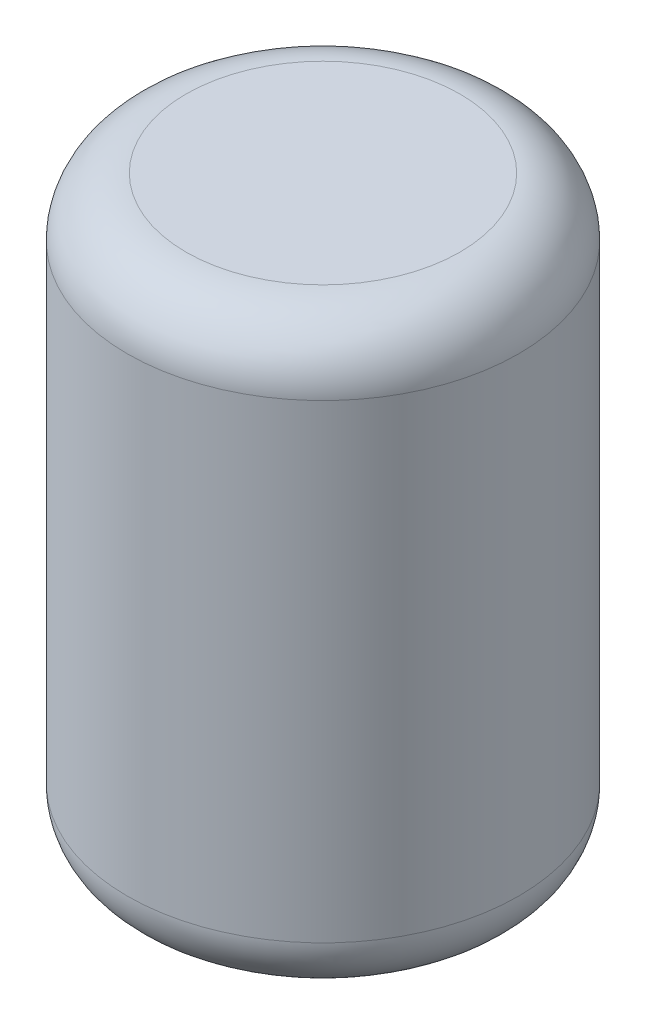
ISO-10303-21;
HEADER;
FILE_DESCRIPTION(('STEP AP214'),'2;1');
FILE_NAME('part.step','',(''),(''),'','','');
FILE_SCHEMA(('AUTOMOTIVE_DESIGN { 1 0 10303 214 1 1 1 1 }'));
ENDSEC;
DATA;
#1=APPLICATION_CONTEXT('core data for automotive mechanical design processes');
#2=APPLICATION_PROTOCOL_DEFINITION('international standard','automotive_design',2000,#1);
#3=PRODUCT_CONTEXT('',#1,'mechanical');
#4=PRODUCT('Part','Part','',(#3));
#5=PRODUCT_RELATED_PRODUCT_CATEGORY('part','',(#4));
#6=PRODUCT_DEFINITION_FORMATION('','',#4);
#7=PRODUCT_DEFINITION_CONTEXT('part definition',#1,'design');
#8=PRODUCT_DEFINITION('design','',#6,#7);
#9=PRODUCT_DEFINITION_SHAPE('','',#8);
#10=(LENGTH_UNIT() NAMED_UNIT(*) SI_UNIT(.MILLI.,.METRE.));
#11=(NAMED_UNIT(*) PLANE_ANGLE_UNIT() SI_UNIT($,.RADIAN.));
#12=(NAMED_UNIT(*) SI_UNIT($,.STERADIAN.) SOLID_ANGLE_UNIT());
#13=UNCERTAINTY_MEASURE_WITH_UNIT(LENGTH_MEASURE(1.E-05),#10,'distance_accuracy_value','');
#14=(GEOMETRIC_REPRESENTATION_CONTEXT(3) GLOBAL_UNCERTAINTY_ASSIGNED_CONTEXT((#13)) GLOBAL_UNIT_ASSIGNED_CONTEXT((#10,
#11,#12)) REPRESENTATION_CONTEXT('',''));
#15=CARTESIAN_POINT('',(0.,0.,0.));
#16=DIRECTION('',(0.,0.,1.));
#17=DIRECTION('',(1.,0.,0.));
#18=AXIS2_PLACEMENT_3D('',#15,#16,#17);
#19=CARTESIAN_POINT('',(0.,-215.,0.));
#20=DIRECTION('',(0.,1.,0.));
#21=DIRECTION('',(-1.,0.,0.));
#22=AXIS2_PLACEMENT_3D('',#19,#20,#21);
#23=TOROIDAL_SURFACE('',#22,70.,30.);
#24=CARTESIAN_POINT('',(0.,-245.,0.));
#25=DIRECTION('',(0.,1.,0.));
#26=DIRECTION('',(-1.,0.,0.));
#27=AXIS2_PLACEMENT_3D('',#24,#25,#26);
#28=CIRCLE('',#27,70.);
#29=CARTESIAN_POINT('',(-70.,-245.,0.));
#30=VERTEX_POINT('',#29);
#31=EDGE_CURVE('E46',#30,#30,#28,.T.);
#32=ORIENTED_EDGE('',*,*,#31,.T.);
#33=EDGE_LOOP('',(#32));
#34=FACE_BOUND('',#33,.T.);
#35=CARTESIAN_POINT('',(0.,-215.,0.));
#36=DIRECTION('',(0.,1.,0.));
#37=DIRECTION('',(-1.,0.,0.));
#38=AXIS2_PLACEMENT_3D('',#35,#36,#37);
#39=CIRCLE('',#38,100.);
#40=CARTESIAN_POINT('',(-100.,-215.,0.));
#41=VERTEX_POINT('',#40);
#42=EDGE_CURVE('E10',#41,#41,#39,.T.);
#43=ORIENTED_EDGE('',*,*,#42,.F.);
#44=EDGE_LOOP('',(#43));
#45=FACE_BOUND('',#44,.T.);
#46=ADVANCED_FACE('F32',(#34,#45),#23,.T.);
#47=CARTESIAN_POINT('',(0.,55.0000000000002,0.));
#48=DIRECTION('',(0.,1.,0.));
#49=DIRECTION('',(-1.,0.,0.));
#50=AXIS2_PLACEMENT_3D('',#47,#48,#49);
#51=CYLINDRICAL_SURFACE('',#50,100.);
#52=ORIENTED_EDGE('',*,*,#42,.T.);
#53=EDGE_LOOP('',(#52));
#54=FACE_BOUND('',#53,.T.);
#55=CARTESIAN_POINT('',(0.,25.0000000000002,0.));
#56=DIRECTION('',(0.,1.,0.));
#57=DIRECTION('',(-1.,0.,0.));
#58=AXIS2_PLACEMENT_3D('',#55,#56,#57);
#59=CIRCLE('',#58,100.);
#60=CARTESIAN_POINT('',(-100.,25.0000000000002,0.));
#61=VERTEX_POINT('',#60);
#62=EDGE_CURVE('E38',#61,#61,#59,.T.);
#63=ORIENTED_EDGE('',*,*,#62,.F.);
#64=EDGE_LOOP('',(#63));
#65=FACE_BOUND('',#64,.T.);
#66=ADVANCED_FACE('F65',(#54,#65),#51,.T.);
#67=CARTESIAN_POINT('',(0.,25.0000000000002,0.));
#68=DIRECTION('',(0.,1.,0.));
#69=DIRECTION('',(-1.,0.,0.));
#70=AXIS2_PLACEMENT_3D('',#67,#68,#69);
#71=TOROIDAL_SURFACE('',#70,70.,30.);
#72=ORIENTED_EDGE('',*,*,#62,.T.);
#73=EDGE_LOOP('',(#72));
#74=FACE_BOUND('',#73,.T.);
#75=CARTESIAN_POINT('',(0.,55.0000000000002,0.));
#76=DIRECTION('',(0.,1.,0.));
#77=DIRECTION('',(-1.,0.,0.));
#78=AXIS2_PLACEMENT_3D('',#75,#76,#77);
#79=CIRCLE('',#78,70.);
#80=CARTESIAN_POINT('',(-70.0000000000001,55.0000000000002,0.));
#81=VERTEX_POINT('',#80);
#82=EDGE_CURVE('E42',#81,#81,#79,.T.);
#83=ORIENTED_EDGE('',*,*,#82,.F.);
#84=EDGE_LOOP('',(#83));
#85=FACE_BOUND('',#84,.T.);
#86=ADVANCED_FACE('F61',(#74,#85),#71,.T.);
#87=CARTESIAN_POINT('',(0.,55.0000000000002,0.));
#88=DIRECTION('',(0.,1.,0.));
#89=DIRECTION('',(-1.,0.,0.));
#90=AXIS2_PLACEMENT_3D('',#87,#88,#89);
#91=PLANE('',#90);
#92=ORIENTED_EDGE('',*,*,#82,.T.);
#93=EDGE_LOOP('',(#92));
#94=FACE_BOUND('',#93,.T.);
#95=ADVANCED_FACE('F56',(#94),#91,.T.);
#96=CARTESIAN_POINT('',(0.,-245.,0.));
#97=DIRECTION('',(0.,-1.,0.));
#98=DIRECTION('',(1.,0.,0.));
#99=AXIS2_PLACEMENT_3D('',#96,#97,#98);
#100=PLANE('',#99);
#101=ORIENTED_EDGE('',*,*,#31,.F.);
#102=EDGE_LOOP('',(#101));
#103=FACE_BOUND('',#102,.T.);
#104=ADVANCED_FACE('F54',(#103),#100,.T.);
#105=CLOSED_SHELL('',(#46,#66,#86,#95,#104));
#106=MANIFOLD_SOLID_BREP('B2',#105);
#107=ADVANCED_BREP_SHAPE_REPRESENTATION('',(#18,#106),#14);
#108=SHAPE_DEFINITION_REPRESENTATION(#9,#107);
ENDSEC;
END-ISO-10303-21;
